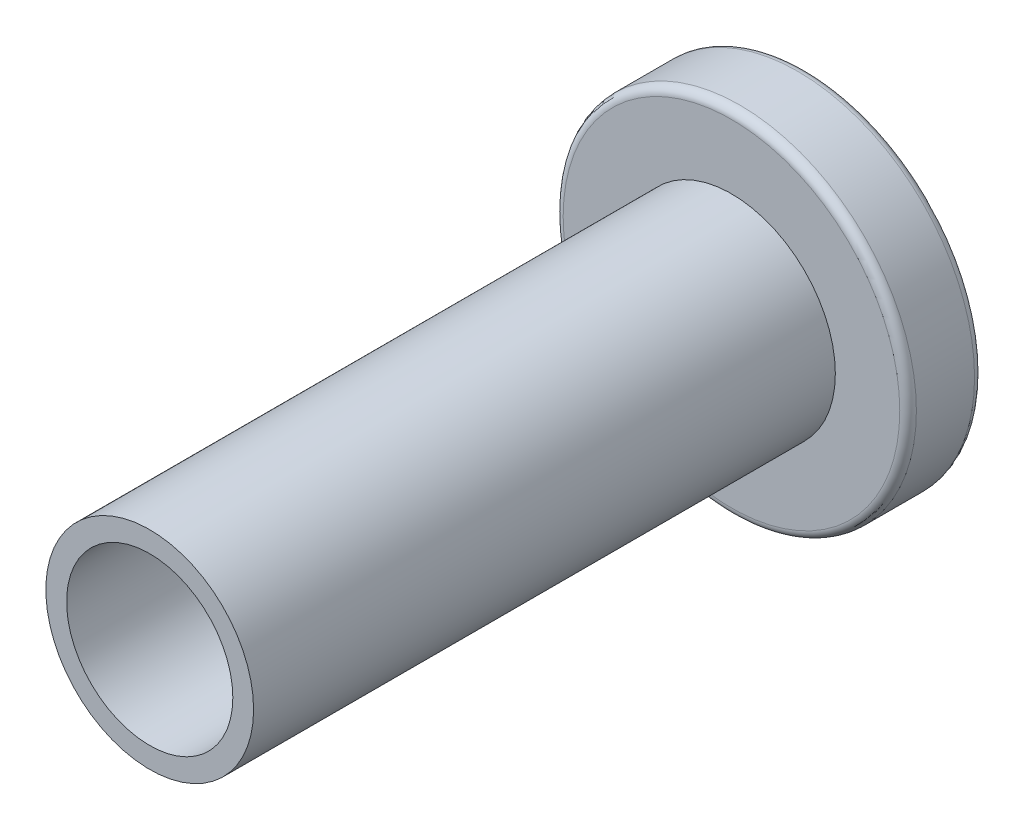
ISO-10303-21;
HEADER;
FILE_DESCRIPTION(('STEP AP214'),'2;1');
FILE_NAME('part.step','',(''),(''),'','','');
FILE_SCHEMA(('AUTOMOTIVE_DESIGN { 1 0 10303 214 1 1 1 1 }'));
ENDSEC;
DATA;
#1=APPLICATION_CONTEXT('core data for automotive mechanical design processes');
#2=APPLICATION_PROTOCOL_DEFINITION('international standard','automotive_design',2000,#1);
#3=PRODUCT_CONTEXT('',#1,'mechanical');
#4=PRODUCT('Part','Part','',(#3));
#5=PRODUCT_RELATED_PRODUCT_CATEGORY('part','',(#4));
#6=PRODUCT_DEFINITION_FORMATION('','',#4);
#7=PRODUCT_DEFINITION_CONTEXT('part definition',#1,'design');
#8=PRODUCT_DEFINITION('design','',#6,#7);
#9=PRODUCT_DEFINITION_SHAPE('','',#8);
#10=(LENGTH_UNIT() NAMED_UNIT(*) SI_UNIT(.MILLI.,.METRE.));
#11=(NAMED_UNIT(*) PLANE_ANGLE_UNIT() SI_UNIT($,.RADIAN.));
#12=(NAMED_UNIT(*) SI_UNIT($,.STERADIAN.) SOLID_ANGLE_UNIT());
#13=UNCERTAINTY_MEASURE_WITH_UNIT(LENGTH_MEASURE(1.E-05),#10,'distance_accuracy_value','');
#14=(GEOMETRIC_REPRESENTATION_CONTEXT(3) GLOBAL_UNCERTAINTY_ASSIGNED_CONTEXT((#13)) GLOBAL_UNIT_ASSIGNED_CONTEXT((#10,
#11,#12)) REPRESENTATION_CONTEXT('',''));
#15=CARTESIAN_POINT('',(0.,0.,0.));
#16=DIRECTION('',(0.,0.,1.));
#17=DIRECTION('',(1.,0.,0.));
#18=AXIS2_PLACEMENT_3D('',#15,#16,#17);
#19=CARTESIAN_POINT('',(0.,0.,1.8));
#20=DIRECTION('',(0.,0.,-1.));
#21=DIRECTION('',(-1.,0.,0.));
#22=AXIS2_PLACEMENT_3D('',#19,#20,#21);
#23=CYLINDRICAL_SURFACE('',#22,4.25);
#24=CARTESIAN_POINT('',(0.,0.,0.2));
#25=DIRECTION('',(0.,0.,1.));
#26=DIRECTION('',(1.,0.,0.));
#27=AXIS2_PLACEMENT_3D('',#24,#25,#26);
#28=CIRCLE('',#27,4.25);
#29=CARTESIAN_POINT('',(4.25,0.,0.2));
#30=VERTEX_POINT('',#29);
#31=EDGE_CURVE('E187',#30,#30,#28,.T.);
#32=ORIENTED_EDGE('',*,*,#31,.T.);
#33=EDGE_LOOP('',(#32));
#34=FACE_BOUND('',#33,.T.);
#35=CARTESIAN_POINT('',(0.,0.,1.6));
#36=DIRECTION('',(0.,0.,1.));
#37=DIRECTION('',(1.,0.,0.));
#38=AXIS2_PLACEMENT_3D('',#35,#36,#37);
#39=CIRCLE('',#38,4.25);
#40=CARTESIAN_POINT('',(4.25,0.,1.6));
#41=VERTEX_POINT('',#40);
#42=EDGE_CURVE('E183',#41,#41,#39,.F.);
#43=ORIENTED_EDGE('',*,*,#42,.T.);
#44=EDGE_LOOP('',(#43));
#45=FACE_BOUND('',#44,.T.);
#46=ADVANCED_FACE('F43',(#34,#45),#23,.T.);
#47=CARTESIAN_POINT('',(0.,0.,1.8));
#48=DIRECTION('',(0.,0.,1.));
#49=DIRECTION('',(1.,0.,0.));
#50=AXIS2_PLACEMENT_3D('',#47,#48,#49);
#51=PLANE('',#50);
#52=CARTESIAN_POINT('',(0.,0.,1.8));
#53=DIRECTION('',(0.,0.,1.));
#54=DIRECTION('',(1.,0.,0.));
#55=AXIS2_PLACEMENT_3D('',#52,#53,#54);
#56=CIRCLE('',#55,4.05);
#57=CARTESIAN_POINT('',(4.05,0.,1.8));
#58=VERTEX_POINT('',#57);
#59=EDGE_CURVE('E11',#58,#58,#56,.T.);
#60=ORIENTED_EDGE('',*,*,#59,.T.);
#61=EDGE_LOOP('',(#60));
#62=FACE_BOUND('',#61,.T.);
#63=CARTESIAN_POINT('',(0.,0.,1.8));
#64=DIRECTION('',(0.,0.,1.));
#65=DIRECTION('',(1.,0.,0.));
#66=AXIS2_PLACEMENT_3D('',#63,#64,#65);
#67=CIRCLE('',#66,2.5);
#68=CARTESIAN_POINT('',(2.5,0.,1.8));
#69=VERTEX_POINT('',#68);
#70=EDGE_CURVE('E171',#69,#69,#67,.T.);
#71=ORIENTED_EDGE('',*,*,#70,.F.);
#72=EDGE_LOOP('',(#71));
#73=FACE_BOUND('',#72,.T.);
#74=ADVANCED_FACE('F204',(#62,#73),#51,.T.);
#75=CARTESIAN_POINT('',(0.,0.,0.));
#76=DIRECTION('',(0.,0.,1.));
#77=DIRECTION('',(1.,0.,0.));
#78=AXIS2_PLACEMENT_3D('',#75,#76,#77);
#79=PLANE('',#78);
#80=DIRECTION('',(0.5,0.866025403784438,0.));
#81=VECTOR('',#80,1.);
#82=CARTESIAN_POINT('',(-1.44337567297407,0.,0.));
#83=LINE('',#82,#81);
#84=CARTESIAN_POINT('',(-1.44337567297407,0.,0.));
#85=VERTEX_POINT('',#84);
#86=CARTESIAN_POINT('',(-0.721687836487032,1.25,0.));
#87=VERTEX_POINT('',#86);
#88=EDGE_CURVE('E139',#85,#87,#83,.T.);
#89=ORIENTED_EDGE('',*,*,#88,.F.);
#90=DIRECTION('',(-0.5,0.866025403784438,0.));
#91=VECTOR('',#90,1.);
#92=CARTESIAN_POINT('',(-0.721687836487033,-1.25,0.));
#93=LINE('',#92,#91);
#94=CARTESIAN_POINT('',(-0.721687836487033,-1.25,0.));
#95=VERTEX_POINT('',#94);
#96=EDGE_CURVE('E59',#95,#85,#93,.T.);
#97=ORIENTED_EDGE('',*,*,#96,.F.);
#98=DIRECTION('',(-1.,0.,0.));
#99=VECTOR('',#98,1.);
#100=CARTESIAN_POINT('',(0.721687836487032,-1.25,0.));
#101=LINE('',#100,#99);
#102=CARTESIAN_POINT('',(0.721687836487032,-1.25,0.));
#103=VERTEX_POINT('',#102);
#104=EDGE_CURVE('E152',#103,#95,#101,.T.);
#105=ORIENTED_EDGE('',*,*,#104,.F.);
#106=DIRECTION('',(-0.5,-0.866025403784438,0.));
#107=VECTOR('',#106,1.);
#108=CARTESIAN_POINT('',(1.44337567297406,0.,0.));
#109=LINE('',#108,#107);
#110=CARTESIAN_POINT('',(1.44337567297406,0.,0.));
#111=VERTEX_POINT('',#110);
#112=EDGE_CURVE('E149',#111,#103,#109,.T.);
#113=ORIENTED_EDGE('',*,*,#112,.F.);
#114=DIRECTION('',(0.5,-0.866025403784438,0.));
#115=VECTOR('',#114,1.);
#116=CARTESIAN_POINT('',(0.721687836487032,1.25,0.));
#117=LINE('',#116,#115);
#118=CARTESIAN_POINT('',(0.721687836487032,1.25,0.));
#119=VERTEX_POINT('',#118);
#120=EDGE_CURVE('E107',#119,#111,#117,.T.);
#121=ORIENTED_EDGE('',*,*,#120,.F.);
#122=DIRECTION('',(1.,0.,0.));
#123=VECTOR('',#122,1.);
#124=CARTESIAN_POINT('',(-0.721687836487032,1.25,0.));
#125=LINE('',#124,#123);
#126=EDGE_CURVE('E143',#87,#119,#125,.T.);
#127=ORIENTED_EDGE('',*,*,#126,.F.);
#128=EDGE_LOOP('',(#89,#97,#105,#113,#121,#127));
#129=FACE_BOUND('',#128,.T.);
#130=CARTESIAN_POINT('',(0.,0.,0.));
#131=DIRECTION('',(0.,0.,1.));
#132=DIRECTION('',(1.,0.,0.));
#133=AXIS2_PLACEMENT_3D('',#130,#131,#132);
#134=CIRCLE('',#133,4.05);
#135=CARTESIAN_POINT('',(4.05,0.,0.));
#136=VERTEX_POINT('',#135);
#137=EDGE_CURVE('E52',#136,#136,#134,.F.);
#138=ORIENTED_EDGE('',*,*,#137,.T.);
#139=EDGE_LOOP('',(#138));
#140=FACE_BOUND('',#139,.T.);
#141=ADVANCED_FACE('F194',(#129,#140),#79,.F.);
#142=CARTESIAN_POINT('',(0.,0.,15.8));
#143=DIRECTION('',(0.,0.,1.));
#144=DIRECTION('',(1.,0.,0.));
#145=AXIS2_PLACEMENT_3D('',#142,#143,#144);
#146=PLANE('',#145);
#147=CARTESIAN_POINT('',(0.,0.,15.8));
#148=DIRECTION('',(0.,0.,1.));
#149=DIRECTION('',(1.,0.,0.));
#150=AXIS2_PLACEMENT_3D('',#147,#148,#149);
#151=CIRCLE('',#150,2.5);
#152=CARTESIAN_POINT('',(2.5,0.,15.8));
#153=VERTEX_POINT('',#152);
#154=EDGE_CURVE('E172',#153,#153,#151,.T.);
#155=ORIENTED_EDGE('',*,*,#154,.T.);
#156=EDGE_LOOP('',(#155));
#157=FACE_BOUND('',#156,.T.);
#158=CARTESIAN_POINT('',(0.,0.,15.8));
#159=DIRECTION('',(0.,0.,1.));
#160=DIRECTION('',(1.,0.,0.));
#161=AXIS2_PLACEMENT_3D('',#158,#159,#160);
#162=CIRCLE('',#161,2.);
#163=CARTESIAN_POINT('',(2.,0.,15.8));
#164=VERTEX_POINT('',#163);
#165=EDGE_CURVE('E158',#164,#164,#162,.T.);
#166=ORIENTED_EDGE('',*,*,#165,.F.);
#167=EDGE_LOOP('',(#166));
#168=FACE_BOUND('',#167,.T.);
#169=ADVANCED_FACE('F221',(#157,#168),#146,.T.);
#170=CARTESIAN_POINT('',(0.,0.,15.8));
#171=DIRECTION('',(0.,0.,-1.));
#172=DIRECTION('',(-1.,0.,0.));
#173=AXIS2_PLACEMENT_3D('',#170,#171,#172);
#174=CYLINDRICAL_SURFACE('',#173,2.5);
#175=ORIENTED_EDGE('',*,*,#154,.F.);
#176=EDGE_LOOP('',(#175));
#177=FACE_BOUND('',#176,.T.);
#178=ORIENTED_EDGE('',*,*,#70,.T.);
#179=EDGE_LOOP('',(#178));
#180=FACE_BOUND('',#179,.T.);
#181=ADVANCED_FACE('F218',(#177,#180),#174,.T.);
#182=CARTESIAN_POINT('',(0.,0.,15.8));
#183=DIRECTION('',(0.,0.,-1.));
#184=DIRECTION('',(-1.,0.,0.));
#185=AXIS2_PLACEMENT_3D('',#182,#183,#184);
#186=CYLINDRICAL_SURFACE('',#185,2.);
#187=ORIENTED_EDGE('',*,*,#165,.T.);
#188=EDGE_LOOP('',(#187));
#189=FACE_BOUND('',#188,.T.);
#190=CARTESIAN_POINT('',(0.,0.,1.8));
#191=DIRECTION('',(0.,0.,1.));
#192=DIRECTION('',(1.,0.,0.));
#193=AXIS2_PLACEMENT_3D('',#190,#191,#192);
#194=CIRCLE('',#193,2.);
#195=CARTESIAN_POINT('',(2.,0.,1.8));
#196=VERTEX_POINT('',#195);
#197=EDGE_CURVE('E176',#196,#196,#194,.F.);
#198=ORIENTED_EDGE('',*,*,#197,.T.);
#199=EDGE_LOOP('',(#198));
#200=FACE_BOUND('',#199,.T.);
#201=ADVANCED_FACE('F220',(#189,#200),#186,.F.);
#202=ORIENTED_EDGE('',*,*,#197,.F.);
#203=EDGE_LOOP('',(#202));
#204=FACE_BOUND('',#203,.T.);
#205=ADVANCED_FACE('F199',(#204),#51,.T.);
#206=CARTESIAN_POINT('',(0.,0.,0.2));
#207=DIRECTION('',(0.,0.,1.));
#208=DIRECTION('',(1.,0.,0.));
#209=AXIS2_PLACEMENT_3D('',#206,#207,#208);
#210=TOROIDAL_SURFACE('',#209,4.05,0.2);
#211=ORIENTED_EDGE('',*,*,#137,.F.);
#212=EDGE_LOOP('',(#211));
#213=FACE_BOUND('',#212,.T.);
#214=ORIENTED_EDGE('',*,*,#31,.F.);
#215=EDGE_LOOP('',(#214));
#216=FACE_BOUND('',#215,.T.);
#217=ADVANCED_FACE('F196',(#213,#216),#210,.T.);
#218=CARTESIAN_POINT('',(0.,0.,1.6));
#219=DIRECTION('',(0.,0.,1.));
#220=DIRECTION('',(1.,0.,0.));
#221=AXIS2_PLACEMENT_3D('',#218,#219,#220);
#222=TOROIDAL_SURFACE('',#221,4.05,0.2);
#223=ORIENTED_EDGE('',*,*,#42,.F.);
#224=EDGE_LOOP('',(#223));
#225=FACE_BOUND('',#224,.T.);
#226=ORIENTED_EDGE('',*,*,#59,.F.);
#227=EDGE_LOOP('',(#226));
#228=FACE_BOUND('',#227,.T.);
#229=ADVANCED_FACE('F45',(#225,#228),#222,.T.);
#230=CARTESIAN_POINT('',(-0.721687836487033,-1.25,1.5));
#231=DIRECTION('',(-0.866025403784439,-0.5,0.));
#232=DIRECTION('',(0.5,-0.866025403784439,0.));
#233=AXIS2_PLACEMENT_3D('',#230,#231,#232);
#234=PLANE('',#233);
#235=ORIENTED_EDGE('',*,*,#96,.T.);
#236=DIRECTION('',(0.,0.,-1.));
#237=VECTOR('',#236,1.);
#238=CARTESIAN_POINT('',(-1.44337567297407,0.,1.5));
#239=LINE('',#238,#237);
#240=CARTESIAN_POINT('',(-1.44337567297407,0.,1.5));
#241=VERTEX_POINT('',#240);
#242=EDGE_CURVE('E89',#241,#85,#239,.T.);
#243=ORIENTED_EDGE('',*,*,#242,.F.);
#244=DIRECTION('',(-0.5,0.866025403784438,0.));
#245=VECTOR('',#244,1.);
#246=CARTESIAN_POINT('',(-0.721687836487033,-1.25,1.5));
#247=LINE('',#246,#245);
#248=CARTESIAN_POINT('',(-0.721687836487033,-1.25,1.5));
#249=VERTEX_POINT('',#248);
#250=EDGE_CURVE('E155',#249,#241,#247,.T.);
#251=ORIENTED_EDGE('',*,*,#250,.F.);
#252=DIRECTION('',(0.,0.,-1.));
#253=VECTOR('',#252,1.);
#254=CARTESIAN_POINT('',(-0.721687836487033,-1.25,1.5));
#255=LINE('',#254,#253);
#256=EDGE_CURVE('E67',#249,#95,#255,.T.);
#257=ORIENTED_EDGE('',*,*,#256,.T.);
#258=EDGE_LOOP('',(#235,#243,#251,#257));
#259=FACE_BOUND('',#258,.T.);
#260=ADVANCED_FACE('F210',(#259),#234,.F.);
#261=CARTESIAN_POINT('',(0.721687836487032,-1.25,1.5));
#262=DIRECTION('',(0.,-1.,0.));
#263=DIRECTION('',(1.,0.,0.));
#264=AXIS2_PLACEMENT_3D('',#261,#262,#263);
#265=PLANE('',#264);
#266=ORIENTED_EDGE('',*,*,#104,.T.);
#267=ORIENTED_EDGE('',*,*,#256,.F.);
#268=DIRECTION('',(-1.,0.,0.));
#269=VECTOR('',#268,1.);
#270=CARTESIAN_POINT('',(0.721687836487032,-1.25,1.5));
#271=LINE('',#270,#269);
#272=CARTESIAN_POINT('',(0.721687836487032,-1.25,1.5));
#273=VERTEX_POINT('',#272);
#274=EDGE_CURVE('E121',#273,#249,#271,.T.);
#275=ORIENTED_EDGE('',*,*,#274,.F.);
#276=DIRECTION('',(0.,0.,-1.));
#277=VECTOR('',#276,1.);
#278=CARTESIAN_POINT('',(0.721687836487032,-1.25,1.5));
#279=LINE('',#278,#277);
#280=EDGE_CURVE('E112',#273,#103,#279,.T.);
#281=ORIENTED_EDGE('',*,*,#280,.T.);
#282=EDGE_LOOP('',(#266,#267,#275,#281));
#283=FACE_BOUND('',#282,.T.);
#284=ADVANCED_FACE('F247',(#283),#265,.F.);
#285=CARTESIAN_POINT('',(1.44337567297406,0.,1.5));
#286=DIRECTION('',(0.866025403784439,-0.5,0.));
#287=DIRECTION('',(0.5,0.866025403784439,0.));
#288=AXIS2_PLACEMENT_3D('',#285,#286,#287);
#289=PLANE('',#288);
#290=ORIENTED_EDGE('',*,*,#112,.T.);
#291=ORIENTED_EDGE('',*,*,#280,.F.);
#292=DIRECTION('',(-0.5,-0.866025403784438,0.));
#293=VECTOR('',#292,1.);
#294=CARTESIAN_POINT('',(1.44337567297406,0.,1.5));
#295=LINE('',#294,#293);
#296=CARTESIAN_POINT('',(1.44337567297406,0.,1.5));
#297=VERTEX_POINT('',#296);
#298=EDGE_CURVE('E116',#297,#273,#295,.T.);
#299=ORIENTED_EDGE('',*,*,#298,.F.);
#300=DIRECTION('',(0.,0.,-1.));
#301=VECTOR('',#300,1.);
#302=CARTESIAN_POINT('',(1.44337567297406,0.,1.5));
#303=LINE('',#302,#301);
#304=EDGE_CURVE('E100',#297,#111,#303,.T.);
#305=ORIENTED_EDGE('',*,*,#304,.T.);
#306=EDGE_LOOP('',(#290,#291,#299,#305));
#307=FACE_BOUND('',#306,.T.);
#308=ADVANCED_FACE('F117',(#307),#289,.F.);
#309=CARTESIAN_POINT('',(0.721687836487032,1.25,1.5));
#310=DIRECTION('',(0.866025403784439,0.5,0.));
#311=DIRECTION('',(-0.5,0.866025403784439,0.));
#312=AXIS2_PLACEMENT_3D('',#309,#310,#311);
#313=PLANE('',#312);
#314=ORIENTED_EDGE('',*,*,#120,.T.);
#315=ORIENTED_EDGE('',*,*,#304,.F.);
#316=DIRECTION('',(0.5,-0.866025403784438,0.));
#317=VECTOR('',#316,1.);
#318=CARTESIAN_POINT('',(0.721687836487032,1.25,1.5));
#319=LINE('',#318,#317);
#320=CARTESIAN_POINT('',(0.721687836487032,1.25,1.5));
#321=VERTEX_POINT('',#320);
#322=EDGE_CURVE('E104',#321,#297,#319,.T.);
#323=ORIENTED_EDGE('',*,*,#322,.F.);
#324=DIRECTION('',(0.,0.,-1.));
#325=VECTOR('',#324,1.);
#326=CARTESIAN_POINT('',(0.721687836487032,1.25,1.5));
#327=LINE('',#326,#325);
#328=EDGE_CURVE('E113',#321,#119,#327,.T.);
#329=ORIENTED_EDGE('',*,*,#328,.T.);
#330=EDGE_LOOP('',(#314,#315,#323,#329));
#331=FACE_BOUND('',#330,.T.);
#332=ADVANCED_FACE('F102',(#331),#313,.F.);
#333=CARTESIAN_POINT('',(-0.721687836487032,1.25,1.5));
#334=DIRECTION('',(0.,1.,0.));
#335=DIRECTION('',(0.,0.,1.));
#336=AXIS2_PLACEMENT_3D('',#333,#334,#335);
#337=PLANE('',#336);
#338=ORIENTED_EDGE('',*,*,#126,.T.);
#339=ORIENTED_EDGE('',*,*,#328,.F.);
#340=DIRECTION('',(1.,0.,0.));
#341=VECTOR('',#340,1.);
#342=CARTESIAN_POINT('',(-0.721687836487032,1.25,1.5));
#343=LINE('',#342,#341);
#344=CARTESIAN_POINT('',(-0.721687836487032,1.25,1.5));
#345=VERTEX_POINT('',#344);
#346=EDGE_CURVE('E127',#345,#321,#343,.T.);
#347=ORIENTED_EDGE('',*,*,#346,.F.);
#348=DIRECTION('',(0.,0.,-1.));
#349=VECTOR('',#348,1.);
#350=CARTESIAN_POINT('',(-0.721687836487032,1.25,1.5));
#351=LINE('',#350,#349);
#352=EDGE_CURVE('E163',#345,#87,#351,.T.);
#353=ORIENTED_EDGE('',*,*,#352,.T.);
#354=EDGE_LOOP('',(#338,#339,#347,#353));
#355=FACE_BOUND('',#354,.T.);
#356=ADVANCED_FACE('F256',(#355),#337,.F.);
#357=CARTESIAN_POINT('',(-1.44337567297407,0.,1.5));
#358=DIRECTION('',(-0.866025403784438,0.5,0.));
#359=DIRECTION('',(-0.5,-0.866025403784438,0.));
#360=AXIS2_PLACEMENT_3D('',#357,#358,#359);
#361=PLANE('',#360);
#362=ORIENTED_EDGE('',*,*,#88,.T.);
#363=ORIENTED_EDGE('',*,*,#352,.F.);
#364=DIRECTION('',(0.5,0.866025403784438,0.));
#365=VECTOR('',#364,1.);
#366=CARTESIAN_POINT('',(-1.44337567297407,0.,1.5));
#367=LINE('',#366,#365);
#368=EDGE_CURVE('E131',#241,#345,#367,.T.);
#369=ORIENTED_EDGE('',*,*,#368,.F.);
#370=ORIENTED_EDGE('',*,*,#242,.T.);
#371=EDGE_LOOP('',(#362,#363,#369,#370));
#372=FACE_BOUND('',#371,.T.);
#373=ADVANCED_FACE('F242',(#372),#361,.F.);
#374=CARTESIAN_POINT('',(0.,0.,1.5));
#375=DIRECTION('',(0.,0.,-1.));
#376=DIRECTION('',(-1.,0.,0.));
#377=AXIS2_PLACEMENT_3D('',#374,#375,#376);
#378=PLANE('',#377);
#379=ORIENTED_EDGE('',*,*,#250,.T.);
#380=ORIENTED_EDGE('',*,*,#368,.T.);
#381=ORIENTED_EDGE('',*,*,#346,.T.);
#382=ORIENTED_EDGE('',*,*,#322,.T.);
#383=ORIENTED_EDGE('',*,*,#298,.T.);
#384=ORIENTED_EDGE('',*,*,#274,.T.);
#385=EDGE_LOOP('',(#379,#380,#381,#382,#383,#384));
#386=FACE_BOUND('',#385,.T.);
#387=ADVANCED_FACE('F124',(#386),#378,.T.);
#388=CLOSED_SHELL('',(#46,#74,#141,#169,#181,#201,#205,#217,#229,#260,#284,#308,#332,#356,#373,#387));
#389=MANIFOLD_SOLID_BREP('B2',#388);
#390=ADVANCED_BREP_SHAPE_REPRESENTATION('',(#18,#389),#14);
#391=SHAPE_DEFINITION_REPRESENTATION(#9,#390);
ENDSEC;
END-ISO-10303-21;
